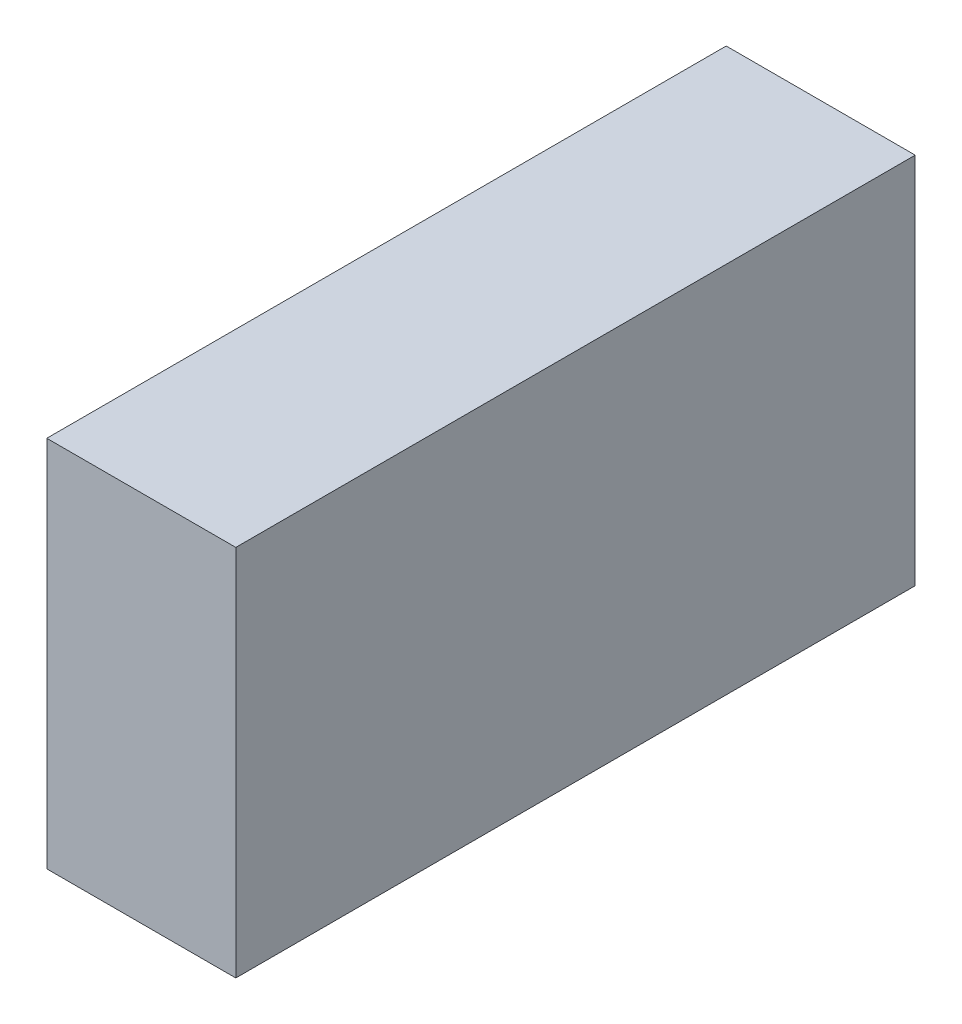
ISO-10303-21;
HEADER;
FILE_DESCRIPTION(('STEP AP214'),'2;1');
FILE_NAME('part.step','',(''),(''),'','','');
FILE_SCHEMA(('AUTOMOTIVE_DESIGN { 1 0 10303 214 1 1 1 1 }'));
ENDSEC;
DATA;
#1=APPLICATION_CONTEXT('core data for automotive mechanical design processes');
#2=APPLICATION_PROTOCOL_DEFINITION('international standard','automotive_design',2000,#1);
#3=PRODUCT_CONTEXT('',#1,'mechanical');
#4=PRODUCT('Part','Part','',(#3));
#5=PRODUCT_RELATED_PRODUCT_CATEGORY('part','',(#4));
#6=PRODUCT_DEFINITION_FORMATION('','',#4);
#7=PRODUCT_DEFINITION_CONTEXT('part definition',#1,'design');
#8=PRODUCT_DEFINITION('design','',#6,#7);
#9=PRODUCT_DEFINITION_SHAPE('','',#8);
#10=(LENGTH_UNIT() NAMED_UNIT(*) SI_UNIT(.MILLI.,.METRE.));
#11=(NAMED_UNIT(*) PLANE_ANGLE_UNIT() SI_UNIT($,.RADIAN.));
#12=(NAMED_UNIT(*) SI_UNIT($,.STERADIAN.) SOLID_ANGLE_UNIT());
#13=UNCERTAINTY_MEASURE_WITH_UNIT(LENGTH_MEASURE(1.E-05),#10,'distance_accuracy_value','');
#14=(GEOMETRIC_REPRESENTATION_CONTEXT(3) GLOBAL_UNCERTAINTY_ASSIGNED_CONTEXT((#13)) GLOBAL_UNIT_ASSIGNED_CONTEXT((#10,
#11,#12)) REPRESENTATION_CONTEXT('',''));
#15=CARTESIAN_POINT('',(0.,0.,0.));
#16=DIRECTION('',(0.,0.,1.));
#17=DIRECTION('',(1.,0.,0.));
#18=AXIS2_PLACEMENT_3D('',#15,#16,#17);
#19=CARTESIAN_POINT('',(18.5,65.441666600241,71.3805604917566));
#20=DIRECTION('',(0.,0.,1.));
#21=DIRECTION('',(0.,-1.,0.));
#22=AXIS2_PLACEMENT_3D('',#19,#20,#21);
#23=PLANE('',#22);
#24=DIRECTION('',(0.,1.,0.));
#25=VECTOR('',#24,1.);
#26=CARTESIAN_POINT('',(0.,65.441666600241,71.3805604917566));
#27=LINE('',#26,#25);
#28=CARTESIAN_POINT('',(0.,28.941666600241,71.3805604917566));
#29=VERTEX_POINT('',#28);
#30=CARTESIAN_POINT('',(0.,65.441666600241,71.3805604917566));
#31=VERTEX_POINT('',#30);
#32=EDGE_CURVE('E97',#29,#31,#27,.T.);
#33=ORIENTED_EDGE('',*,*,#32,.T.);
#34=DIRECTION('',(-1.,0.,0.));
#35=VECTOR('',#34,1.);
#36=CARTESIAN_POINT('',(18.5,65.441666600241,71.3805604917566));
#37=LINE('',#36,#35);
#38=CARTESIAN_POINT('',(18.5,65.441666600241,71.3805604917566));
#39=VERTEX_POINT('',#38);
#40=EDGE_CURVE('E11',#39,#31,#37,.T.);
#41=ORIENTED_EDGE('',*,*,#40,.F.);
#42=DIRECTION('',(0.,1.,0.));
#43=VECTOR('',#42,1.);
#44=CARTESIAN_POINT('',(18.5,65.441666600241,71.3805604917566));
#45=LINE('',#44,#43);
#46=CARTESIAN_POINT('',(18.5,28.941666600241,71.3805604917566));
#47=VERTEX_POINT('',#46);
#48=EDGE_CURVE('E85',#47,#39,#45,.T.);
#49=ORIENTED_EDGE('',*,*,#48,.F.);
#50=DIRECTION('',(-1.,0.,0.));
#51=VECTOR('',#50,1.);
#52=CARTESIAN_POINT('',(18.5,28.941666600241,71.3805604917566));
#53=LINE('',#52,#51);
#54=EDGE_CURVE('E93',#47,#29,#53,.T.);
#55=ORIENTED_EDGE('',*,*,#54,.T.);
#56=EDGE_LOOP('',(#33,#41,#49,#55));
#57=FACE_BOUND('',#56,.T.);
#58=ADVANCED_FACE('F34',(#57),#23,.F.);
#59=CARTESIAN_POINT('',(18.5,65.441666600241,71.3805604917566));
#60=DIRECTION('',(0.,-1.,0.));
#61=DIRECTION('',(0.,0.,-1.));
#62=AXIS2_PLACEMENT_3D('',#59,#60,#61);
#63=PLANE('',#62);
#64=DIRECTION('',(0.,0.,1.));
#65=VECTOR('',#64,1.);
#66=CARTESIAN_POINT('',(0.,65.441666600241,71.3805604917566));
#67=LINE('',#66,#65);
#68=CARTESIAN_POINT('',(0.,65.441666600241,137.880560491757));
#69=VERTEX_POINT('',#68);
#70=EDGE_CURVE('E89',#31,#69,#67,.T.);
#71=ORIENTED_EDGE('',*,*,#70,.T.);
#72=DIRECTION('',(-1.,0.,0.));
#73=VECTOR('',#72,1.);
#74=CARTESIAN_POINT('',(18.5,65.441666600241,137.880560491757));
#75=LINE('',#74,#73);
#76=CARTESIAN_POINT('',(18.5,65.441666600241,137.880560491757));
#77=VERTEX_POINT('',#76);
#78=EDGE_CURVE('E42',#77,#69,#75,.T.);
#79=ORIENTED_EDGE('',*,*,#78,.F.);
#80=DIRECTION('',(0.,0.,1.));
#81=VECTOR('',#80,1.);
#82=CARTESIAN_POINT('',(18.5,65.441666600241,71.3805604917566));
#83=LINE('',#82,#81);
#84=EDGE_CURVE('E80',#39,#77,#83,.T.);
#85=ORIENTED_EDGE('',*,*,#84,.F.);
#86=ORIENTED_EDGE('',*,*,#40,.T.);
#87=EDGE_LOOP('',(#71,#79,#85,#86));
#88=FACE_BOUND('',#87,.T.);
#89=ADVANCED_FACE('F88',(#88),#63,.F.);
#90=CARTESIAN_POINT('',(18.5,65.441666600241,137.880560491757));
#91=DIRECTION('',(0.,0.,-1.));
#92=DIRECTION('',(-1.,0.,0.));
#93=AXIS2_PLACEMENT_3D('',#90,#91,#92);
#94=PLANE('',#93);
#95=DIRECTION('',(0.,-1.,0.));
#96=VECTOR('',#95,1.);
#97=CARTESIAN_POINT('',(0.,65.441666600241,137.880560491757));
#98=LINE('',#97,#96);
#99=CARTESIAN_POINT('',(0.,28.941666600241,137.880560491757));
#100=VERTEX_POINT('',#99);
#101=EDGE_CURVE('E67',#69,#100,#98,.T.);
#102=ORIENTED_EDGE('',*,*,#101,.T.);
#103=DIRECTION('',(-1.,0.,0.));
#104=VECTOR('',#103,1.);
#105=CARTESIAN_POINT('',(18.5,28.941666600241,137.880560491757));
#106=LINE('',#105,#104);
#107=CARTESIAN_POINT('',(18.5,28.941666600241,137.880560491757));
#108=VERTEX_POINT('',#107);
#109=EDGE_CURVE('E90',#108,#100,#106,.T.);
#110=ORIENTED_EDGE('',*,*,#109,.F.);
#111=DIRECTION('',(0.,-1.,0.));
#112=VECTOR('',#111,1.);
#113=CARTESIAN_POINT('',(18.5,65.441666600241,137.880560491757));
#114=LINE('',#113,#112);
#115=EDGE_CURVE('E83',#77,#108,#114,.T.);
#116=ORIENTED_EDGE('',*,*,#115,.F.);
#117=ORIENTED_EDGE('',*,*,#78,.T.);
#118=EDGE_LOOP('',(#102,#110,#116,#117));
#119=FACE_BOUND('',#118,.T.);
#120=ADVANCED_FACE('F91',(#119),#94,.F.);
#121=CARTESIAN_POINT('',(18.5,28.941666600241,71.3805604917566));
#122=DIRECTION('',(0.,1.,0.));
#123=DIRECTION('',(0.,0.,1.));
#124=AXIS2_PLACEMENT_3D('',#121,#122,#123);
#125=PLANE('',#124);
#126=DIRECTION('',(0.,0.,-1.));
#127=VECTOR('',#126,1.);
#128=CARTESIAN_POINT('',(0.,28.941666600241,71.3805604917566));
#129=LINE('',#128,#127);
#130=EDGE_CURVE('E73',#100,#29,#129,.T.);
#131=ORIENTED_EDGE('',*,*,#130,.T.);
#132=ORIENTED_EDGE('',*,*,#54,.F.);
#133=DIRECTION('',(0.,0.,-1.));
#134=VECTOR('',#133,1.);
#135=CARTESIAN_POINT('',(18.5,28.941666600241,71.3805604917566));
#136=LINE('',#135,#134);
#137=EDGE_CURVE('E50',#108,#47,#136,.T.);
#138=ORIENTED_EDGE('',*,*,#137,.F.);
#139=ORIENTED_EDGE('',*,*,#109,.T.);
#140=EDGE_LOOP('',(#131,#132,#138,#139));
#141=FACE_BOUND('',#140,.T.);
#142=ADVANCED_FACE('F104',(#141),#125,.F.);
#143=CARTESIAN_POINT('',(18.5,0.,0.));
#144=DIRECTION('',(-1.,0.,0.));
#145=DIRECTION('',(0.,0.,1.));
#146=AXIS2_PLACEMENT_3D('',#143,#144,#145);
#147=PLANE('',#146);
#148=ORIENTED_EDGE('',*,*,#48,.T.);
#149=ORIENTED_EDGE('',*,*,#84,.T.);
#150=ORIENTED_EDGE('',*,*,#115,.T.);
#151=ORIENTED_EDGE('',*,*,#137,.T.);
#152=EDGE_LOOP('',(#148,#149,#150,#151));
#153=FACE_BOUND('',#152,.T.);
#154=ADVANCED_FACE('F81',(#153),#147,.F.);
#155=CARTESIAN_POINT('',(0.,0.,0.));
#156=DIRECTION('',(-1.,0.,0.));
#157=DIRECTION('',(0.,0.,1.));
#158=AXIS2_PLACEMENT_3D('',#155,#156,#157);
#159=PLANE('',#158);
#160=ORIENTED_EDGE('',*,*,#32,.F.);
#161=ORIENTED_EDGE('',*,*,#130,.F.);
#162=ORIENTED_EDGE('',*,*,#101,.F.);
#163=ORIENTED_EDGE('',*,*,#70,.F.);
#164=EDGE_LOOP('',(#160,#161,#162,#163));
#165=FACE_BOUND('',#164,.T.);
#166=ADVANCED_FACE('F107',(#165),#159,.T.);
#167=CLOSED_SHELL('',(#58,#89,#120,#142,#154,#166));
#168=MANIFOLD_SOLID_BREP('B2',#167);
#169=ADVANCED_BREP_SHAPE_REPRESENTATION('',(#18,#168),#14);
#170=SHAPE_DEFINITION_REPRESENTATION(#9,#169);
ENDSEC;
END-ISO-10303-21;
